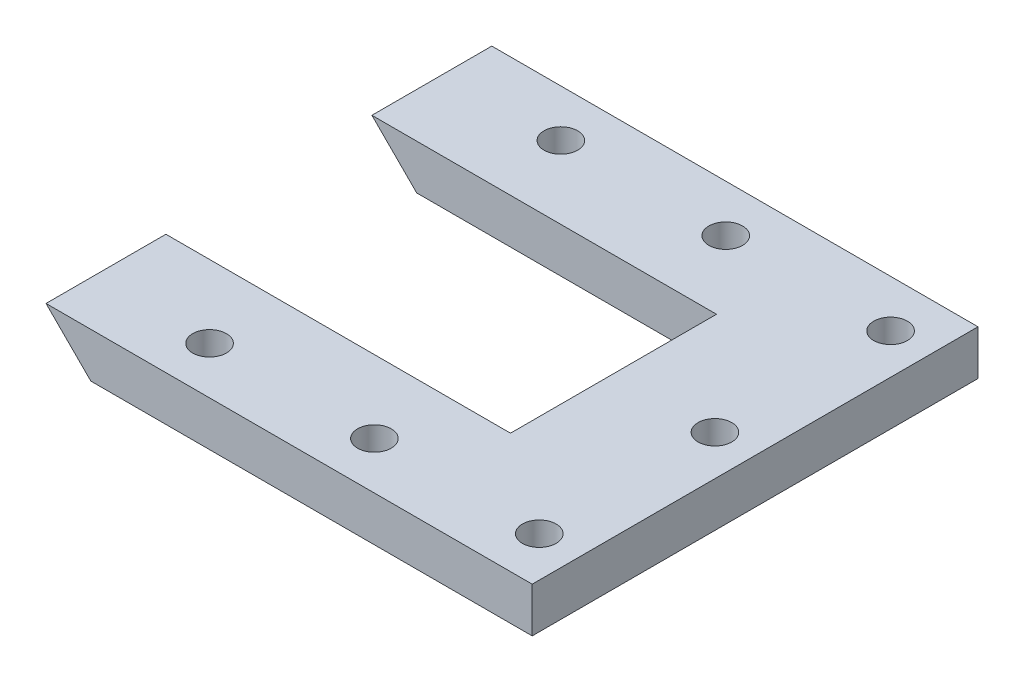
ISO-10303-21;
HEADER;
FILE_DESCRIPTION(('STEP AP214'),'2;1');
FILE_NAME('part.step','',(''),(''),'','','');
FILE_SCHEMA(('AUTOMOTIVE_DESIGN { 1 0 10303 214 1 1 1 1 }'));
ENDSEC;
DATA;
#1=APPLICATION_CONTEXT('core data for automotive mechanical design processes');
#2=APPLICATION_PROTOCOL_DEFINITION('international standard','automotive_design',2000,#1);
#3=PRODUCT_CONTEXT('',#1,'mechanical');
#4=PRODUCT('Part','Part','',(#3));
#5=PRODUCT_RELATED_PRODUCT_CATEGORY('part','',(#4));
#6=PRODUCT_DEFINITION_FORMATION('','',#4);
#7=PRODUCT_DEFINITION_CONTEXT('part definition',#1,'design');
#8=PRODUCT_DEFINITION('design','',#6,#7);
#9=PRODUCT_DEFINITION_SHAPE('','',#8);
#10=(LENGTH_UNIT() NAMED_UNIT(*) SI_UNIT(.MILLI.,.METRE.));
#11=(NAMED_UNIT(*) PLANE_ANGLE_UNIT() SI_UNIT($,.RADIAN.));
#12=(NAMED_UNIT(*) SI_UNIT($,.STERADIAN.) SOLID_ANGLE_UNIT());
#13=UNCERTAINTY_MEASURE_WITH_UNIT(LENGTH_MEASURE(1.E-05),#10,'distance_accuracy_value','');
#14=(GEOMETRIC_REPRESENTATION_CONTEXT(3) GLOBAL_UNCERTAINTY_ASSIGNED_CONTEXT((#13)) GLOBAL_UNIT_ASSIGNED_CONTEXT((#10,
#11,#12)) REPRESENTATION_CONTEXT('',''));
#15=CARTESIAN_POINT('',(0.,0.,0.));
#16=DIRECTION('',(0.,0.,1.));
#17=DIRECTION('',(1.,0.,0.));
#18=AXIS2_PLACEMENT_3D('',#15,#16,#17);
#19=CARTESIAN_POINT('',(51.4985,4.7498,47.2186));
#20=DIRECTION('',(-1.,0.,0.));
#21=DIRECTION('',(0.,0.,1.));
#22=AXIS2_PLACEMENT_3D('',#19,#20,#21);
#23=PLANE('',#22);
#24=DIRECTION('',(0.,0.,-1.));
#25=VECTOR('',#24,1.);
#26=CARTESIAN_POINT('',(51.4985,-4.7498,47.2186));
#27=LINE('',#26,#25);
#28=CARTESIAN_POINT('',(51.4985,-4.7498,47.2186));
#29=VERTEX_POINT('',#28);
#30=CARTESIAN_POINT('',(51.4985,-4.7498,-47.2186));
#31=VERTEX_POINT('',#30);
#32=EDGE_CURVE('E129',#29,#31,#27,.T.);
#33=ORIENTED_EDGE('',*,*,#32,.T.);
#34=DIRECTION('',(0.,-1.,0.));
#35=VECTOR('',#34,1.);
#36=CARTESIAN_POINT('',(51.4985,4.7498,-47.2186));
#37=LINE('',#36,#35);
#38=CARTESIAN_POINT('',(51.4985,4.7498,-47.2186));
#39=VERTEX_POINT('',#38);
#40=EDGE_CURVE('E50',#39,#31,#37,.T.);
#41=ORIENTED_EDGE('',*,*,#40,.F.);
#42=DIRECTION('',(0.,0.,-1.));
#43=VECTOR('',#42,1.);
#44=CARTESIAN_POINT('',(51.4985,4.7498,47.2186));
#45=LINE('',#44,#43);
#46=CARTESIAN_POINT('',(51.4985,4.7498,47.2186));
#47=VERTEX_POINT('',#46);
#48=EDGE_CURVE('E130',#47,#39,#45,.T.);
#49=ORIENTED_EDGE('',*,*,#48,.F.);
#50=DIRECTION('',(0.,-1.,0.));
#51=VECTOR('',#50,1.);
#52=CARTESIAN_POINT('',(51.4985,4.7498,47.2186));
#53=LINE('',#52,#51);
#54=EDGE_CURVE('E140',#47,#29,#53,.T.);
#55=ORIENTED_EDGE('',*,*,#54,.T.);
#56=EDGE_LOOP('',(#33,#41,#49,#55));
#57=FACE_BOUND('',#56,.T.);
#58=ADVANCED_FACE('F43',(#57),#23,.F.);
#59=CARTESIAN_POINT('',(-51.4985,4.7498,-47.2186));
#60=DIRECTION('',(0.,0.,1.));
#61=DIRECTION('',(1.,0.,0.));
#62=AXIS2_PLACEMENT_3D('',#59,#60,#61);
#63=PLANE('',#62);
#64=DIRECTION('',(-1.,0.,0.));
#65=VECTOR('',#64,1.);
#66=CARTESIAN_POINT('',(-51.4985,-4.7498,-47.2186));
#67=LINE('',#66,#65);
#68=CARTESIAN_POINT('',(-41.9989,-4.7498,-47.2186));
#69=VERTEX_POINT('',#68);
#70=EDGE_CURVE('E131',#31,#69,#67,.T.);
#71=ORIENTED_EDGE('',*,*,#70,.T.);
#72=DIRECTION('',(-0.707106781186548,0.707106781186547,0.));
#73=VECTOR('',#72,1.);
#74=CARTESIAN_POINT('',(-32.4993,-14.2494,-47.2186));
#75=LINE('',#74,#73);
#76=CARTESIAN_POINT('',(-51.4985,4.7498,-47.2186));
#77=VERTEX_POINT('',#76);
#78=EDGE_CURVE('E115',#69,#77,#75,.T.);
#79=ORIENTED_EDGE('',*,*,#78,.T.);
#80=DIRECTION('',(-1.,0.,0.));
#81=VECTOR('',#80,1.);
#82=CARTESIAN_POINT('',(-51.4985,4.7498,-47.2186));
#83=LINE('',#82,#81);
#84=EDGE_CURVE('E134',#39,#77,#83,.T.);
#85=ORIENTED_EDGE('',*,*,#84,.F.);
#86=ORIENTED_EDGE('',*,*,#40,.T.);
#87=EDGE_LOOP('',(#71,#79,#85,#86));
#88=FACE_BOUND('',#87,.T.);
#89=ADVANCED_FACE('F144',(#88),#63,.F.);
#90=CARTESIAN_POINT('',(-51.4985,4.7498,47.2186));
#91=DIRECTION('',(0.,0.,-1.));
#92=DIRECTION('',(-1.,0.,0.));
#93=AXIS2_PLACEMENT_3D('',#90,#91,#92);
#94=PLANE('',#93);
#95=DIRECTION('',(1.,0.,0.));
#96=VECTOR('',#95,1.);
#97=CARTESIAN_POINT('',(-51.4985,4.7498,47.2186));
#98=LINE('',#97,#96);
#99=CARTESIAN_POINT('',(-51.4985,4.7498,47.2186));
#100=VERTEX_POINT('',#99);
#101=EDGE_CURVE('E123',#100,#47,#98,.T.);
#102=ORIENTED_EDGE('',*,*,#101,.F.);
#103=DIRECTION('',(-0.707106781186548,0.707106781186547,0.));
#104=VECTOR('',#103,1.);
#105=CARTESIAN_POINT('',(-32.4993,-14.2494,47.2186));
#106=LINE('',#105,#104);
#107=CARTESIAN_POINT('',(-41.9989,-4.7498,47.2186));
#108=VERTEX_POINT('',#107);
#109=EDGE_CURVE('E109',#108,#100,#106,.T.);
#110=ORIENTED_EDGE('',*,*,#109,.F.);
#111=DIRECTION('',(1.,0.,0.));
#112=VECTOR('',#111,1.);
#113=CARTESIAN_POINT('',(-51.4985,-4.7498,47.2186));
#114=LINE('',#113,#112);
#115=EDGE_CURVE('E121',#108,#29,#114,.T.);
#116=ORIENTED_EDGE('',*,*,#115,.T.);
#117=ORIENTED_EDGE('',*,*,#54,.F.);
#118=EDGE_LOOP('',(#102,#110,#116,#117));
#119=FACE_BOUND('',#118,.T.);
#120=ADVANCED_FACE('F119',(#119),#94,.F.);
#121=CARTESIAN_POINT('',(0.,4.7498,0.));
#122=DIRECTION('',(0.,-1.,0.));
#123=DIRECTION('',(0.,0.,-1.));
#124=AXIS2_PLACEMENT_3D('',#121,#122,#123);
#125=PLANE('',#124);
#126=CARTESIAN_POINT('',(42.9895,4.7498,0.));
#127=DIRECTION('',(0.,1.,0.));
#128=DIRECTION('',(0.,0.,1.));
#129=AXIS2_PLACEMENT_3D('',#126,#127,#128);
#130=CIRCLE('',#129,3.5687);
#131=CARTESIAN_POINT('',(42.9895,4.7498,3.5687));
#132=VERTEX_POINT('',#131);
#133=EDGE_CURVE('E210',#132,#132,#130,.T.);
#134=ORIENTED_EDGE('',*,*,#133,.F.);
#135=EDGE_LOOP('',(#134));
#136=FACE_BOUND('',#135,.T.);
#137=CARTESIAN_POINT('',(8.06450000000001,4.7498,37.211));
#138=DIRECTION('',(0.,1.,0.));
#139=DIRECTION('',(0.,0.,1.));
#140=AXIS2_PLACEMENT_3D('',#137,#138,#139);
#141=CIRCLE('',#140,3.5687);
#142=CARTESIAN_POINT('',(8.06450000000001,4.7498,40.7797));
#143=VERTEX_POINT('',#142);
#144=EDGE_CURVE('E202',#143,#143,#141,.T.);
#145=ORIENTED_EDGE('',*,*,#144,.F.);
#146=EDGE_LOOP('',(#145));
#147=FACE_BOUND('',#146,.T.);
#148=CARTESIAN_POINT('',(42.9895,4.7498,37.211));
#149=DIRECTION('',(0.,1.,0.));
#150=DIRECTION('',(0.,0.,1.));
#151=AXIS2_PLACEMENT_3D('',#148,#149,#150);
#152=CIRCLE('',#151,3.5687);
#153=CARTESIAN_POINT('',(42.9895,4.7498,40.7797));
#154=VERTEX_POINT('',#153);
#155=EDGE_CURVE('E196',#154,#154,#152,.T.);
#156=ORIENTED_EDGE('',*,*,#155,.F.);
#157=EDGE_LOOP('',(#156));
#158=FACE_BOUND('',#157,.T.);
#159=CARTESIAN_POINT('',(-26.8605,4.7498,-37.211));
#160=DIRECTION('',(0.,1.,0.));
#161=DIRECTION('',(0.,0.,1.));
#162=AXIS2_PLACEMENT_3D('',#159,#160,#161);
#163=CIRCLE('',#162,3.5687);
#164=CARTESIAN_POINT('',(-26.8605,4.7498,-33.6423));
#165=VERTEX_POINT('',#164);
#166=EDGE_CURVE('E190',#165,#165,#163,.T.);
#167=ORIENTED_EDGE('',*,*,#166,.F.);
#168=EDGE_LOOP('',(#167));
#169=FACE_BOUND('',#168,.T.);
#170=CARTESIAN_POINT('',(8.06450000000001,4.7498,-37.211));
#171=DIRECTION('',(0.,1.,0.));
#172=DIRECTION('',(0.,0.,1.));
#173=AXIS2_PLACEMENT_3D('',#170,#171,#172);
#174=CIRCLE('',#173,3.5687);
#175=CARTESIAN_POINT('',(8.06450000000001,4.7498,-33.6423));
#176=VERTEX_POINT('',#175);
#177=EDGE_CURVE('E183',#176,#176,#174,.T.);
#178=ORIENTED_EDGE('',*,*,#177,.F.);
#179=EDGE_LOOP('',(#178));
#180=FACE_BOUND('',#179,.T.);
#181=CARTESIAN_POINT('',(42.9895,4.7498,-37.211));
#182=DIRECTION('',(0.,1.,0.));
#183=DIRECTION('',(0.,0.,1.));
#184=AXIS2_PLACEMENT_3D('',#181,#182,#183);
#185=CIRCLE('',#184,3.5687);
#186=CARTESIAN_POINT('',(42.9895,4.7498,-33.6423));
#187=VERTEX_POINT('',#186);
#188=EDGE_CURVE('E207',#187,#187,#185,.T.);
#189=ORIENTED_EDGE('',*,*,#188,.F.);
#190=EDGE_LOOP('',(#189));
#191=FACE_BOUND('',#190,.T.);
#192=CARTESIAN_POINT('',(-26.8605,4.7498,37.211));
#193=DIRECTION('',(0.,1.,0.));
#194=DIRECTION('',(0.,0.,1.));
#195=AXIS2_PLACEMENT_3D('',#192,#193,#194);
#196=CIRCLE('',#195,3.5687);
#197=CARTESIAN_POINT('',(-26.8605,4.7498,40.7797));
#198=VERTEX_POINT('',#197);
#199=EDGE_CURVE('E124',#198,#198,#196,.T.);
#200=ORIENTED_EDGE('',*,*,#199,.F.);
#201=EDGE_LOOP('',(#200));
#202=FACE_BOUND('',#201,.T.);
#203=DIRECTION('',(0.,0.,1.));
#204=VECTOR('',#203,1.);
#205=CARTESIAN_POINT('',(-51.4985,4.7498,47.2186));
#206=LINE('',#205,#204);
#207=CARTESIAN_POINT('',(-51.4985,4.7498,-21.8186));
#208=VERTEX_POINT('',#207);
#209=EDGE_CURVE('E154',#77,#208,#206,.T.);
#210=ORIENTED_EDGE('',*,*,#209,.T.);
#211=DIRECTION('',(-1.,0.,0.));
#212=VECTOR('',#211,1.);
#213=CARTESIAN_POINT('',(-154.4955,4.7498,-21.8186));
#214=LINE('',#213,#212);
#215=CARTESIAN_POINT('',(21.5011,4.7498,-21.8186));
#216=VERTEX_POINT('',#215);
#217=EDGE_CURVE('E161',#216,#208,#214,.T.);
#218=ORIENTED_EDGE('',*,*,#217,.F.);
#219=DIRECTION('',(0.,0.,-1.));
#220=VECTOR('',#219,1.);
#221=CARTESIAN_POINT('',(21.5011,4.7498,21.8186));
#222=LINE('',#221,#220);
#223=CARTESIAN_POINT('',(21.5011,4.7498,21.8186));
#224=VERTEX_POINT('',#223);
#225=EDGE_CURVE('E165',#224,#216,#222,.T.);
#226=ORIENTED_EDGE('',*,*,#225,.F.);
#227=DIRECTION('',(1.,0.,0.));
#228=VECTOR('',#227,1.);
#229=CARTESIAN_POINT('',(-154.4955,4.7498,21.8186));
#230=LINE('',#229,#228);
#231=CARTESIAN_POINT('',(-51.4985,4.7498,21.8186));
#232=VERTEX_POINT('',#231);
#233=EDGE_CURVE('E168',#232,#224,#230,.T.);
#234=ORIENTED_EDGE('',*,*,#233,.F.);
#235=EDGE_CURVE('E157',#232,#100,#206,.T.);
#236=ORIENTED_EDGE('',*,*,#235,.T.);
#237=ORIENTED_EDGE('',*,*,#101,.T.);
#238=ORIENTED_EDGE('',*,*,#48,.T.);
#239=ORIENTED_EDGE('',*,*,#84,.T.);
#240=EDGE_LOOP('',(#210,#218,#226,#234,#236,#237,#238,#239));
#241=FACE_BOUND('',#240,.T.);
#242=ADVANCED_FACE('F222',(#136,#147,#158,#169,#180,#191,#202,#241),#125,.F.);
#243=CARTESIAN_POINT('',(0.,-4.7498,0.));
#244=DIRECTION('',(0.,-1.,0.));
#245=DIRECTION('',(0.,0.,-1.));
#246=AXIS2_PLACEMENT_3D('',#243,#244,#245);
#247=PLANE('',#246);
#248=CARTESIAN_POINT('',(42.9895,-4.7498,0.));
#249=DIRECTION('',(0.,1.,0.));
#250=DIRECTION('',(0.,0.,1.));
#251=AXIS2_PLACEMENT_3D('',#248,#249,#250);
#252=CIRCLE('',#251,3.5687);
#253=CARTESIAN_POINT('',(42.9895,-4.7498,3.5687));
#254=VERTEX_POINT('',#253);
#255=EDGE_CURVE('E213',#254,#254,#252,.T.);
#256=ORIENTED_EDGE('',*,*,#255,.T.);
#257=EDGE_LOOP('',(#256));
#258=FACE_BOUND('',#257,.T.);
#259=CARTESIAN_POINT('',(8.06450000000001,-4.7498,37.211));
#260=DIRECTION('',(0.,1.,0.));
#261=DIRECTION('',(0.,0.,1.));
#262=AXIS2_PLACEMENT_3D('',#259,#260,#261);
#263=CIRCLE('',#262,3.5687);
#264=CARTESIAN_POINT('',(8.06450000000001,-4.7498,40.7797));
#265=VERTEX_POINT('',#264);
#266=EDGE_CURVE('E180',#265,#265,#263,.T.);
#267=ORIENTED_EDGE('',*,*,#266,.T.);
#268=EDGE_LOOP('',(#267));
#269=FACE_BOUND('',#268,.T.);
#270=CARTESIAN_POINT('',(42.9895,-4.7498,37.211));
#271=DIRECTION('',(0.,1.,0.));
#272=DIRECTION('',(0.,0.,1.));
#273=AXIS2_PLACEMENT_3D('',#270,#271,#272);
#274=CIRCLE('',#273,3.5687);
#275=CARTESIAN_POINT('',(42.9895,-4.7498,40.7797));
#276=VERTEX_POINT('',#275);
#277=EDGE_CURVE('E199',#276,#276,#274,.T.);
#278=ORIENTED_EDGE('',*,*,#277,.T.);
#279=EDGE_LOOP('',(#278));
#280=FACE_BOUND('',#279,.T.);
#281=CARTESIAN_POINT('',(-26.8605,-4.7498,-37.211));
#282=DIRECTION('',(0.,1.,0.));
#283=DIRECTION('',(0.,0.,1.));
#284=AXIS2_PLACEMENT_3D('',#281,#282,#283);
#285=CIRCLE('',#284,3.5687);
#286=CARTESIAN_POINT('',(-26.8605,-4.7498,-33.6423));
#287=VERTEX_POINT('',#286);
#288=EDGE_CURVE('E193',#287,#287,#285,.T.);
#289=ORIENTED_EDGE('',*,*,#288,.T.);
#290=EDGE_LOOP('',(#289));
#291=FACE_BOUND('',#290,.T.);
#292=CARTESIAN_POINT('',(8.06450000000001,-4.7498,-37.211));
#293=DIRECTION('',(0.,1.,0.));
#294=DIRECTION('',(0.,0.,1.));
#295=AXIS2_PLACEMENT_3D('',#292,#293,#294);
#296=CIRCLE('',#295,3.5687);
#297=CARTESIAN_POINT('',(8.06450000000001,-4.7498,-33.6423));
#298=VERTEX_POINT('',#297);
#299=EDGE_CURVE('E186',#298,#298,#296,.T.);
#300=ORIENTED_EDGE('',*,*,#299,.T.);
#301=EDGE_LOOP('',(#300));
#302=FACE_BOUND('',#301,.T.);
#303=CARTESIAN_POINT('',(42.9895,-4.7498,-37.211));
#304=DIRECTION('',(0.,1.,0.));
#305=DIRECTION('',(0.,0.,1.));
#306=AXIS2_PLACEMENT_3D('',#303,#304,#305);
#307=CIRCLE('',#306,3.5687);
#308=CARTESIAN_POINT('',(42.9895,-4.7498,-33.6423));
#309=VERTEX_POINT('',#308);
#310=EDGE_CURVE('E187',#309,#309,#307,.T.);
#311=ORIENTED_EDGE('',*,*,#310,.T.);
#312=EDGE_LOOP('',(#311));
#313=FACE_BOUND('',#312,.T.);
#314=CARTESIAN_POINT('',(-26.8605,-4.7498,37.211));
#315=DIRECTION('',(0.,1.,0.));
#316=DIRECTION('',(0.,0.,1.));
#317=AXIS2_PLACEMENT_3D('',#314,#315,#316);
#318=CIRCLE('',#317,3.5687);
#319=CARTESIAN_POINT('',(-26.8605,-4.7498,40.7797));
#320=VERTEX_POINT('',#319);
#321=EDGE_CURVE('E177',#320,#320,#318,.T.);
#322=ORIENTED_EDGE('',*,*,#321,.T.);
#323=EDGE_LOOP('',(#322));
#324=FACE_BOUND('',#323,.T.);
#325=DIRECTION('',(0.,0.,1.));
#326=VECTOR('',#325,1.);
#327=CARTESIAN_POINT('',(-41.9989,-4.7498,0.));
#328=LINE('',#327,#326);
#329=CARTESIAN_POINT('',(-41.9989,-4.74980000000001,-21.8186));
#330=VERTEX_POINT('',#329);
#331=EDGE_CURVE('E57',#69,#330,#328,.T.);
#332=ORIENTED_EDGE('',*,*,#331,.F.);
#333=ORIENTED_EDGE('',*,*,#70,.F.);
#334=ORIENTED_EDGE('',*,*,#32,.F.);
#335=ORIENTED_EDGE('',*,*,#115,.F.);
#336=CARTESIAN_POINT('',(-41.9989,-4.7498,21.8186));
#337=VERTEX_POINT('',#336);
#338=EDGE_CURVE('E106',#337,#108,#328,.T.);
#339=ORIENTED_EDGE('',*,*,#338,.F.);
#340=DIRECTION('',(1.,0.,0.));
#341=VECTOR('',#340,1.);
#342=CARTESIAN_POINT('',(-154.4955,-4.7498,21.8186));
#343=LINE('',#342,#341);
#344=CARTESIAN_POINT('',(21.5011,-4.7498,21.8186));
#345=VERTEX_POINT('',#344);
#346=EDGE_CURVE('E164',#337,#345,#343,.T.);
#347=ORIENTED_EDGE('',*,*,#346,.T.);
#348=DIRECTION('',(0.,0.,-1.));
#349=VECTOR('',#348,1.);
#350=CARTESIAN_POINT('',(21.5011,-4.7498,21.8186));
#351=LINE('',#350,#349);
#352=CARTESIAN_POINT('',(21.5011,-4.7498,-21.8186));
#353=VERTEX_POINT('',#352);
#354=EDGE_CURVE('E171',#345,#353,#351,.T.);
#355=ORIENTED_EDGE('',*,*,#354,.T.);
#356=DIRECTION('',(-1.,0.,0.));
#357=VECTOR('',#356,1.);
#358=CARTESIAN_POINT('',(-154.4955,-4.7498,-21.8186));
#359=LINE('',#358,#357);
#360=EDGE_CURVE('E64',#353,#330,#359,.T.);
#361=ORIENTED_EDGE('',*,*,#360,.T.);
#362=EDGE_LOOP('',(#332,#333,#334,#335,#339,#347,#355,#361));
#363=FACE_BOUND('',#362,.T.);
#364=ADVANCED_FACE('F127',(#258,#269,#280,#291,#302,#313,#324,#363),#247,.T.);
#365=CARTESIAN_POINT('',(-154.4955,-4.7498,-21.8186));
#366=DIRECTION('',(0.,0.,-1.));
#367=DIRECTION('',(-1.,0.,0.));
#368=AXIS2_PLACEMENT_3D('',#365,#366,#367);
#369=PLANE('',#368);
#370=ORIENTED_EDGE('',*,*,#217,.T.);
#371=DIRECTION('',(0.707106781186548,-0.707106781186548,0.));
#372=VECTOR('',#371,1.);
#373=CARTESIAN_POINT('',(-98.2472,51.4985,-21.8186));
#374=LINE('',#373,#372);
#375=EDGE_CURVE('E114',#208,#330,#374,.T.);
#376=ORIENTED_EDGE('',*,*,#375,.T.);
#377=ORIENTED_EDGE('',*,*,#360,.F.);
#378=DIRECTION('',(0.,1.,0.));
#379=VECTOR('',#378,1.);
#380=CARTESIAN_POINT('',(21.5011,-4.7498,-21.8186));
#381=LINE('',#380,#379);
#382=EDGE_CURVE('E149',#353,#216,#381,.T.);
#383=ORIENTED_EDGE('',*,*,#382,.T.);
#384=EDGE_LOOP('',(#370,#376,#377,#383));
#385=FACE_BOUND('',#384,.T.);
#386=ADVANCED_FACE('F241',(#385),#369,.F.);
#387=CARTESIAN_POINT('',(-154.4955,-4.7498,21.8186));
#388=DIRECTION('',(0.,0.,1.));
#389=DIRECTION('',(1.,0.,0.));
#390=AXIS2_PLACEMENT_3D('',#387,#388,#389);
#391=PLANE('',#390);
#392=ORIENTED_EDGE('',*,*,#346,.F.);
#393=DIRECTION('',(-0.707106781186548,0.707106781186548,0.));
#394=VECTOR('',#393,1.);
#395=CARTESIAN_POINT('',(-98.2472,51.4985,21.8186));
#396=LINE('',#395,#394);
#397=EDGE_CURVE('E11',#337,#232,#396,.T.);
#398=ORIENTED_EDGE('',*,*,#397,.T.);
#399=ORIENTED_EDGE('',*,*,#233,.T.);
#400=DIRECTION('',(0.,1.,0.));
#401=VECTOR('',#400,1.);
#402=CARTESIAN_POINT('',(21.5011,-4.7498,21.8186));
#403=LINE('',#402,#401);
#404=EDGE_CURVE('E150',#345,#224,#403,.T.);
#405=ORIENTED_EDGE('',*,*,#404,.F.);
#406=EDGE_LOOP('',(#392,#398,#399,#405));
#407=FACE_BOUND('',#406,.T.);
#408=ADVANCED_FACE('F248',(#407),#391,.F.);
#409=CARTESIAN_POINT('',(21.5011,-4.7498,21.8186));
#410=DIRECTION('',(1.,0.,0.));
#411=DIRECTION('',(0.,0.,-1.));
#412=AXIS2_PLACEMENT_3D('',#409,#410,#411);
#413=PLANE('',#412);
#414=ORIENTED_EDGE('',*,*,#225,.T.);
#415=ORIENTED_EDGE('',*,*,#382,.F.);
#416=ORIENTED_EDGE('',*,*,#354,.F.);
#417=ORIENTED_EDGE('',*,*,#404,.T.);
#418=EDGE_LOOP('',(#414,#415,#416,#417));
#419=FACE_BOUND('',#418,.T.);
#420=ADVANCED_FACE('F244',(#419),#413,.F.);
#421=CARTESIAN_POINT('',(-32.4993,-14.2494,-47.2186));
#422=DIRECTION('',(0.707106781186548,0.707106781186548,0.));
#423=DIRECTION('',(-0.707106781186548,0.707106781186548,0.));
#424=AXIS2_PLACEMENT_3D('',#421,#422,#423);
#425=PLANE('',#424);
#426=ORIENTED_EDGE('',*,*,#397,.F.);
#427=ORIENTED_EDGE('',*,*,#338,.T.);
#428=ORIENTED_EDGE('',*,*,#109,.T.);
#429=ORIENTED_EDGE('',*,*,#235,.F.);
#430=EDGE_LOOP('',(#426,#427,#428,#429));
#431=FACE_BOUND('',#430,.T.);
#432=ADVANCED_FACE('F108',(#431),#425,.F.);
#433=ORIENTED_EDGE('',*,*,#78,.F.);
#434=ORIENTED_EDGE('',*,*,#331,.T.);
#435=ORIENTED_EDGE('',*,*,#375,.F.);
#436=ORIENTED_EDGE('',*,*,#209,.F.);
#437=EDGE_LOOP('',(#433,#434,#435,#436));
#438=FACE_BOUND('',#437,.T.);
#439=ADVANCED_FACE('F240',(#438),#425,.F.);
#440=CARTESIAN_POINT('',(-26.8605,4.7498,37.211));
#441=DIRECTION('',(0.,-1.,0.));
#442=DIRECTION('',(0.,0.,-1.));
#443=AXIS2_PLACEMENT_3D('',#440,#441,#442);
#444=CYLINDRICAL_SURFACE('',#443,3.5687);
#445=ORIENTED_EDGE('',*,*,#199,.T.);
#446=EDGE_LOOP('',(#445));
#447=FACE_BOUND('',#446,.T.);
#448=ORIENTED_EDGE('',*,*,#321,.F.);
#449=EDGE_LOOP('',(#448));
#450=FACE_BOUND('',#449,.T.);
#451=ADVANCED_FACE('F286',(#447,#450),#444,.F.);
#452=CARTESIAN_POINT('',(42.9895,4.7498,-37.211));
#453=DIRECTION('',(0.,-1.,0.));
#454=DIRECTION('',(0.,0.,-1.));
#455=AXIS2_PLACEMENT_3D('',#452,#453,#454);
#456=CYLINDRICAL_SURFACE('',#455,3.5687);
#457=ORIENTED_EDGE('',*,*,#188,.T.);
#458=EDGE_LOOP('',(#457));
#459=FACE_BOUND('',#458,.T.);
#460=ORIENTED_EDGE('',*,*,#310,.F.);
#461=EDGE_LOOP('',(#460));
#462=FACE_BOUND('',#461,.T.);
#463=ADVANCED_FACE('F288',(#459,#462),#456,.F.);
#464=CARTESIAN_POINT('',(8.06450000000001,4.7498,-37.211));
#465=DIRECTION('',(0.,-1.,0.));
#466=DIRECTION('',(0.,0.,-1.));
#467=AXIS2_PLACEMENT_3D('',#464,#465,#466);
#468=CYLINDRICAL_SURFACE('',#467,3.5687);
#469=ORIENTED_EDGE('',*,*,#177,.T.);
#470=EDGE_LOOP('',(#469));
#471=FACE_BOUND('',#470,.T.);
#472=ORIENTED_EDGE('',*,*,#299,.F.);
#473=EDGE_LOOP('',(#472));
#474=FACE_BOUND('',#473,.T.);
#475=ADVANCED_FACE('F295',(#471,#474),#468,.F.);
#476=CARTESIAN_POINT('',(-26.8605,4.7498,-37.211));
#477=DIRECTION('',(0.,-1.,0.));
#478=DIRECTION('',(0.,0.,-1.));
#479=AXIS2_PLACEMENT_3D('',#476,#477,#478);
#480=CYLINDRICAL_SURFACE('',#479,3.5687);
#481=ORIENTED_EDGE('',*,*,#166,.T.);
#482=EDGE_LOOP('',(#481));
#483=FACE_BOUND('',#482,.T.);
#484=ORIENTED_EDGE('',*,*,#288,.F.);
#485=EDGE_LOOP('',(#484));
#486=FACE_BOUND('',#485,.T.);
#487=ADVANCED_FACE('F302',(#483,#486),#480,.F.);
#488=CARTESIAN_POINT('',(42.9895,4.7498,37.211));
#489=DIRECTION('',(0.,-1.,0.));
#490=DIRECTION('',(0.,0.,-1.));
#491=AXIS2_PLACEMENT_3D('',#488,#489,#490);
#492=CYLINDRICAL_SURFACE('',#491,3.5687);
#493=ORIENTED_EDGE('',*,*,#155,.T.);
#494=EDGE_LOOP('',(#493));
#495=FACE_BOUND('',#494,.T.);
#496=ORIENTED_EDGE('',*,*,#277,.F.);
#497=EDGE_LOOP('',(#496));
#498=FACE_BOUND('',#497,.T.);
#499=ADVANCED_FACE('F306',(#495,#498),#492,.F.);
#500=CARTESIAN_POINT('',(8.06450000000001,4.7498,37.211));
#501=DIRECTION('',(0.,-1.,0.));
#502=DIRECTION('',(0.,0.,-1.));
#503=AXIS2_PLACEMENT_3D('',#500,#501,#502);
#504=CYLINDRICAL_SURFACE('',#503,3.5687);
#505=ORIENTED_EDGE('',*,*,#144,.T.);
#506=EDGE_LOOP('',(#505));
#507=FACE_BOUND('',#506,.T.);
#508=ORIENTED_EDGE('',*,*,#266,.F.);
#509=EDGE_LOOP('',(#508));
#510=FACE_BOUND('',#509,.T.);
#511=ADVANCED_FACE('F310',(#507,#510),#504,.F.);
#512=CARTESIAN_POINT('',(42.9895,4.7498,0.));
#513=DIRECTION('',(0.,-1.,0.));
#514=DIRECTION('',(0.,0.,-1.));
#515=AXIS2_PLACEMENT_3D('',#512,#513,#514);
#516=CYLINDRICAL_SURFACE('',#515,3.5687);
#517=ORIENTED_EDGE('',*,*,#133,.T.);
#518=EDGE_LOOP('',(#517));
#519=FACE_BOUND('',#518,.T.);
#520=ORIENTED_EDGE('',*,*,#255,.F.);
#521=EDGE_LOOP('',(#520));
#522=FACE_BOUND('',#521,.T.);
#523=ADVANCED_FACE('F219',(#519,#522),#516,.F.);
#524=CLOSED_SHELL('',(#58,#89,#120,#242,#364,#386,#408,#420,#432,#439,#451,#463,#475,#487,#499,
#511,#523));
#525=MANIFOLD_SOLID_BREP('B2',#524);
#526=ADVANCED_BREP_SHAPE_REPRESENTATION('',(#18,#525),#14);
#527=SHAPE_DEFINITION_REPRESENTATION(#9,#526);
ENDSEC;
END-ISO-10303-21;
